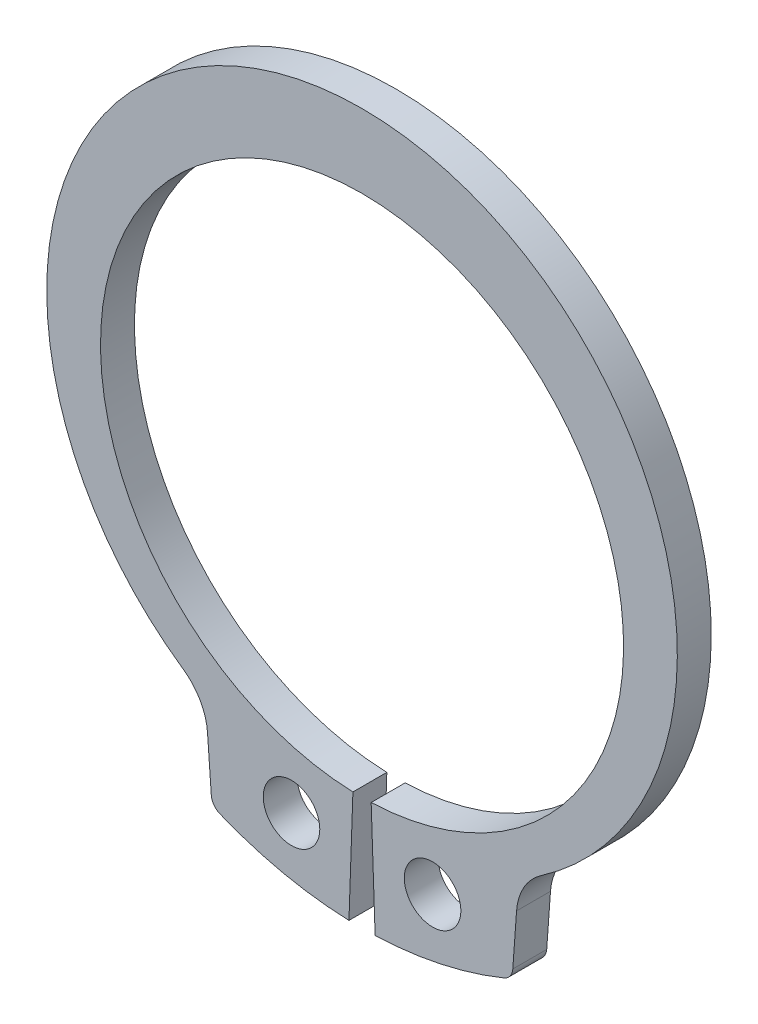
ISO-10303-21;
HEADER;
FILE_DESCRIPTION(('STEP AP214'),'2;1');
FILE_NAME('part.step','',(''),(''),'','','');
FILE_SCHEMA(('AUTOMOTIVE_DESIGN { 1 0 10303 214 1 1 1 1 }'));
ENDSEC;
DATA;
#1=APPLICATION_CONTEXT('core data for automotive mechanical design processes');
#2=APPLICATION_PROTOCOL_DEFINITION('international standard','automotive_design',2000,#1);
#3=PRODUCT_CONTEXT('',#1,'mechanical');
#4=PRODUCT('Part','Part','',(#3));
#5=PRODUCT_RELATED_PRODUCT_CATEGORY('part','',(#4));
#6=PRODUCT_DEFINITION_FORMATION('','',#4);
#7=PRODUCT_DEFINITION_CONTEXT('part definition',#1,'design');
#8=PRODUCT_DEFINITION('design','',#6,#7);
#9=PRODUCT_DEFINITION_SHAPE('','',#8);
#10=(LENGTH_UNIT() NAMED_UNIT(*) SI_UNIT(.MILLI.,.METRE.));
#11=(NAMED_UNIT(*) PLANE_ANGLE_UNIT() SI_UNIT($,.RADIAN.));
#12=(NAMED_UNIT(*) SI_UNIT($,.STERADIAN.) SOLID_ANGLE_UNIT());
#13=UNCERTAINTY_MEASURE_WITH_UNIT(LENGTH_MEASURE(1.E-05),#10,'distance_accuracy_value','');
#14=(GEOMETRIC_REPRESENTATION_CONTEXT(3) GLOBAL_UNCERTAINTY_ASSIGNED_CONTEXT((#13)) GLOBAL_UNIT_ASSIGNED_CONTEXT((#10,
#11,#12)) REPRESENTATION_CONTEXT('',''));
#15=CARTESIAN_POINT('',(0.,0.,0.));
#16=DIRECTION('',(0.,0.,1.));
#17=DIRECTION('',(1.,0.,0.));
#18=AXIS2_PLACEMENT_3D('',#15,#16,#17);
#19=CARTESIAN_POINT('',(0.,0.699014962890159,0.6));
#20=DIRECTION('',(0.,0.,1.));
#21=DIRECTION('',(1.,0.,0.));
#22=AXIS2_PLACEMENT_3D('',#19,#20,#21);
#23=PLANE('',#22);
#24=DIRECTION('',(0.0720475958887649,-0.997401195069792,0.));
#25=VECTOR('',#24,1.);
#26=CARTESIAN_POINT('',(-5.30952849671275,-12.148477213781,0.6));
#27=LINE('',#26,#25);
#28=CARTESIAN_POINT('',(-5.46518902907064,-9.99356837770187,0.6));
#29=VERTEX_POINT('',#28);
#30=CARTESIAN_POINT('',(-5.3317276412391,-11.841160182491,0.6));
#31=VERTEX_POINT('',#30);
#32=EDGE_CURVE('E218',#29,#31,#27,.T.);
#33=ORIENTED_EDGE('',*,*,#32,.T.);
#34=CARTESIAN_POINT('',(-4.82957061953166,-11.8048867086357,0.6));
#35=DIRECTION('',(0.,0.,1.));
#36=DIRECTION('',(1.,0.,0.));
#37=AXIS2_PLACEMENT_3D('',#34,#35,#36);
#38=CIRCLE('',#37,0.503465430149513);
#39=CARTESIAN_POINT('',(-5.02020927117973,-12.2708634718476,0.6));
#40=VERTEX_POINT('',#39);
#41=EDGE_CURVE('E12',#31,#40,#38,.T.);
#42=ORIENTED_EDGE('',*,*,#41,.T.);
#43=CARTESIAN_POINT('',(0.,0.,0.6));
#44=DIRECTION('',(0.,0.,1.));
#45=DIRECTION('',(1.,0.,0.));
#46=AXIS2_PLACEMENT_3D('',#43,#44,#45);
#47=CIRCLE('',#46,13.2580764619594);
#48=CARTESIAN_POINT('',(-0.462700195765678,-13.25,0.6));
#49=VERTEX_POINT('',#48);
#50=EDGE_CURVE('E222',#40,#49,#47,.T.);
#51=ORIENTED_EDGE('',*,*,#50,.T.);
#52=DIRECTION('',(0.0348994967025027,0.999390827019096,0.));
#53=VECTOR('',#52,1.);
#54=CARTESIAN_POINT('',(-0.462700195765678,-13.25,0.6));
#55=LINE('',#54,#53);
#56=CARTESIAN_POINT('',(-0.322820344498148,-9.24436514992663,0.6));
#57=VERTEX_POINT('',#56);
#58=EDGE_CURVE('E225',#49,#57,#55,.T.);
#59=ORIENTED_EDGE('',*,*,#58,.T.);
#60=CARTESIAN_POINT('',(0.,0.,0.6));
#61=DIRECTION('',(0.,0.,-1.));
#62=DIRECTION('',(1.,0.,0.));
#63=AXIS2_PLACEMENT_3D('',#60,#61,#62);
#64=CIRCLE('',#63,9.25);
#65=CARTESIAN_POINT('',(0.322820344498144,-9.24436514992663,0.6));
#66=VERTEX_POINT('',#65);
#67=EDGE_CURVE('E160',#57,#66,#64,.T.);
#68=ORIENTED_EDGE('',*,*,#67,.T.);
#69=DIRECTION('',(-0.0348994967025022,0.999390827019096,0.));
#70=VECTOR('',#69,1.);
#71=CARTESIAN_POINT('',(0.462700195765671,-13.25,0.6));
#72=LINE('',#71,#70);
#73=CARTESIAN_POINT('',(0.462700195765671,-13.25,0.6));
#74=VERTEX_POINT('',#73);
#75=EDGE_CURVE('E138',#74,#66,#72,.T.);
#76=ORIENTED_EDGE('',*,*,#75,.F.);
#77=CARTESIAN_POINT('',(0.,0.,0.6));
#78=DIRECTION('',(0.,0.,-1.));
#79=DIRECTION('',(-1.,0.,0.));
#80=AXIS2_PLACEMENT_3D('',#77,#78,#79);
#81=CIRCLE('',#80,13.2580764619594);
#82=CARTESIAN_POINT('',(5.02020927117973,-12.2708634718476,0.6));
#83=VERTEX_POINT('',#82);
#84=EDGE_CURVE('E149',#83,#74,#81,.T.);
#85=ORIENTED_EDGE('',*,*,#84,.F.);
#86=CARTESIAN_POINT('',(4.82957061953165,-11.8048867086357,0.6));
#87=DIRECTION('',(0.,0.,-1.));
#88=DIRECTION('',(-1.,0.,0.));
#89=AXIS2_PLACEMENT_3D('',#86,#87,#88);
#90=CIRCLE('',#89,0.503465430149513);
#91=CARTESIAN_POINT('',(5.3317276412391,-11.841160182491,0.6));
#92=VERTEX_POINT('',#91);
#93=EDGE_CURVE('E202',#92,#83,#90,.T.);
#94=ORIENTED_EDGE('',*,*,#93,.F.);
#95=DIRECTION('',(-0.0720475958887654,-0.997401195069792,0.));
#96=VECTOR('',#95,1.);
#97=CARTESIAN_POINT('',(5.30952849671274,-12.148477213781,0.6));
#98=LINE('',#97,#96);
#99=CARTESIAN_POINT('',(5.46518902907063,-9.99356837770188,0.6));
#100=VERTEX_POINT('',#99);
#101=EDGE_CURVE('E156',#100,#92,#98,.T.);
#102=ORIENTED_EDGE('',*,*,#101,.F.);
#103=CARTESIAN_POINT('',(7.47381711590044,-10.1386622731234,0.6));
#104=DIRECTION('',(0.,0.,-1.));
#105=DIRECTION('',(-1.,0.,0.));
#106=AXIS2_PLACEMENT_3D('',#103,#104,#105);
#107=CIRCLE('',#106,2.01386172059805);
#108=CARTESIAN_POINT('',(6.33052737820182,-8.48079388107196,0.6));
#109=VERTEX_POINT('',#108);
#110=EDGE_CURVE('E189',#109,#100,#107,.F.);
#111=ORIENTED_EDGE('',*,*,#110,.F.);
#112=CARTESIAN_POINT('',(0.,0.699014962890159,0.6));
#113=DIRECTION('',(0.,0.,1.));
#114=DIRECTION('',(1.,0.,0.));
#115=AXIS2_PLACEMENT_3D('',#112,#113,#114);
#116=CIRCLE('',#115,11.1509850371099);
#117=CARTESIAN_POINT('',(-6.33052737820182,-8.48079388107196,0.6));
#118=VERTEX_POINT('',#117);
#119=EDGE_CURVE('E214',#109,#118,#116,.T.);
#120=ORIENTED_EDGE('',*,*,#119,.T.);
#121=CARTESIAN_POINT('',(-7.47381711590044,-10.1386622731234,0.6));
#122=DIRECTION('',(0.,0.,1.));
#123=DIRECTION('',(1.,0.,0.));
#124=AXIS2_PLACEMENT_3D('',#121,#122,#123);
#125=CIRCLE('',#124,2.01386172059805);
#126=EDGE_CURVE('E262',#118,#29,#125,.F.);
#127=ORIENTED_EDGE('',*,*,#126,.T.);
#128=EDGE_LOOP('',(#33,#42,#51,#59,#68,#76,#85,#94,#102,#111,#120,#127));
#129=FACE_BOUND('',#128,.T.);
#130=CARTESIAN_POINT('',(-2.49406971966085,-10.9741966784737,0.6));
#131=DIRECTION('',(0.,0.,1.));
#132=DIRECTION('',(1.,0.,0.));
#133=AXIS2_PLACEMENT_3D('',#130,#131,#132);
#134=CIRCLE('',#133,1.);
#135=CARTESIAN_POINT('',(-1.49406971966085,-10.9741966784737,0.6));
#136=VERTEX_POINT('',#135);
#137=EDGE_CURVE('E206',#136,#136,#134,.T.);
#138=ORIENTED_EDGE('',*,*,#137,.F.);
#139=EDGE_LOOP('',(#138));
#140=FACE_BOUND('',#139,.T.);
#141=CARTESIAN_POINT('',(2.49406971966084,-10.9741966784737,0.6));
#142=DIRECTION('',(0.,0.,-1.));
#143=DIRECTION('',(-1.,0.,0.));
#144=AXIS2_PLACEMENT_3D('',#141,#142,#143);
#145=CIRCLE('',#144,1.);
#146=CARTESIAN_POINT('',(1.49406971966084,-10.9741966784737,0.6));
#147=VERTEX_POINT('',#146);
#148=EDGE_CURVE('E174',#147,#147,#145,.T.);
#149=ORIENTED_EDGE('',*,*,#148,.T.);
#150=EDGE_LOOP('',(#149));
#151=FACE_BOUND('',#150,.T.);
#152=ADVANCED_FACE('F43',(#129,#140,#151),#23,.T.);
#153=CARTESIAN_POINT('',(0.,0.699014962890159,-0.6));
#154=DIRECTION('',(0.,0.,1.));
#155=DIRECTION('',(1.,0.,0.));
#156=AXIS2_PLACEMENT_3D('',#153,#154,#155);
#157=PLANE('',#156);
#158=CARTESIAN_POINT('',(0.,0.,-0.6));
#159=DIRECTION('',(0.,0.,1.));
#160=DIRECTION('',(1.,0.,0.));
#161=AXIS2_PLACEMENT_3D('',#158,#159,#160);
#162=CIRCLE('',#161,13.2580764619594);
#163=CARTESIAN_POINT('',(-5.02020927117973,-12.2708634718476,-0.6));
#164=VERTEX_POINT('',#163);
#165=CARTESIAN_POINT('',(-0.462700195765678,-13.25,-0.6));
#166=VERTEX_POINT('',#165);
#167=EDGE_CURVE('E237',#164,#166,#162,.T.);
#168=ORIENTED_EDGE('',*,*,#167,.F.);
#169=CARTESIAN_POINT('',(-4.82957061953166,-11.8048867086357,-0.6));
#170=DIRECTION('',(0.,0.,1.));
#171=DIRECTION('',(1.,0.,0.));
#172=AXIS2_PLACEMENT_3D('',#169,#170,#171);
#173=CIRCLE('',#172,0.503465430149513);
#174=CARTESIAN_POINT('',(-5.3317276412391,-11.841160182491,-0.6));
#175=VERTEX_POINT('',#174);
#176=EDGE_CURVE('E66',#164,#175,#173,.F.);
#177=ORIENTED_EDGE('',*,*,#176,.T.);
#178=DIRECTION('',(0.0720475958887649,-0.997401195069792,0.));
#179=VECTOR('',#178,1.);
#180=CARTESIAN_POINT('',(-5.30952849671275,-12.148477213781,-0.6));
#181=LINE('',#180,#179);
#182=CARTESIAN_POINT('',(-5.46518902907064,-9.99356837770187,-0.6));
#183=VERTEX_POINT('',#182);
#184=EDGE_CURVE('E234',#183,#175,#181,.T.);
#185=ORIENTED_EDGE('',*,*,#184,.F.);
#186=CARTESIAN_POINT('',(-7.47381711590044,-10.1386622731234,-0.6));
#187=DIRECTION('',(0.,0.,1.));
#188=DIRECTION('',(1.,0.,0.));
#189=AXIS2_PLACEMENT_3D('',#186,#187,#188);
#190=CIRCLE('',#189,2.01386172059805);
#191=CARTESIAN_POINT('',(-6.33052737820182,-8.48079388107196,-0.6));
#192=VERTEX_POINT('',#191);
#193=EDGE_CURVE('E259',#183,#192,#190,.T.);
#194=ORIENTED_EDGE('',*,*,#193,.T.);
#195=CARTESIAN_POINT('',(0.,0.699014962890159,-0.6));
#196=DIRECTION('',(0.,0.,1.));
#197=DIRECTION('',(1.,0.,0.));
#198=AXIS2_PLACEMENT_3D('',#195,#196,#197);
#199=CIRCLE('',#198,11.1509850371099);
#200=CARTESIAN_POINT('',(6.33052737820182,-8.48079388107196,-0.6));
#201=VERTEX_POINT('',#200);
#202=EDGE_CURVE('E210',#201,#192,#199,.T.);
#203=ORIENTED_EDGE('',*,*,#202,.F.);
#204=CARTESIAN_POINT('',(7.47381711590044,-10.1386622731234,-0.6));
#205=DIRECTION('',(0.,0.,-1.));
#206=DIRECTION('',(-1.,0.,0.));
#207=AXIS2_PLACEMENT_3D('',#204,#205,#206);
#208=CIRCLE('',#207,2.01386172059805);
#209=CARTESIAN_POINT('',(5.46518902907063,-9.99356837770188,-0.6));
#210=VERTEX_POINT('',#209);
#211=EDGE_CURVE('E185',#210,#201,#208,.T.);
#212=ORIENTED_EDGE('',*,*,#211,.F.);
#213=DIRECTION('',(-0.0720475958887654,-0.997401195069792,0.));
#214=VECTOR('',#213,1.);
#215=CARTESIAN_POINT('',(5.30952849671274,-12.148477213781,-0.6));
#216=LINE('',#215,#214);
#217=CARTESIAN_POINT('',(5.3317276412391,-11.841160182491,-0.6));
#218=VERTEX_POINT('',#217);
#219=EDGE_CURVE('E169',#210,#218,#216,.T.);
#220=ORIENTED_EDGE('',*,*,#219,.T.);
#221=CARTESIAN_POINT('',(4.82957061953165,-11.8048867086357,-0.6));
#222=DIRECTION('',(0.,0.,-1.));
#223=DIRECTION('',(-1.,0.,0.));
#224=AXIS2_PLACEMENT_3D('',#221,#222,#223);
#225=CIRCLE('',#224,0.503465430149513);
#226=CARTESIAN_POINT('',(5.02020927117973,-12.2708634718476,-0.6));
#227=VERTEX_POINT('',#226);
#228=EDGE_CURVE('E195',#227,#218,#225,.F.);
#229=ORIENTED_EDGE('',*,*,#228,.F.);
#230=CARTESIAN_POINT('',(0.,0.,-0.6));
#231=DIRECTION('',(0.,0.,-1.));
#232=DIRECTION('',(-1.,0.,0.));
#233=AXIS2_PLACEMENT_3D('',#230,#231,#232);
#234=CIRCLE('',#233,13.2580764619594);
#235=CARTESIAN_POINT('',(0.462700195765671,-13.25,-0.6));
#236=VERTEX_POINT('',#235);
#237=EDGE_CURVE('E173',#227,#236,#234,.T.);
#238=ORIENTED_EDGE('',*,*,#237,.T.);
#239=DIRECTION('',(-0.0348994967025022,0.999390827019096,0.));
#240=VECTOR('',#239,1.);
#241=CARTESIAN_POINT('',(0.462700195765671,-13.25,-0.6));
#242=LINE('',#241,#240);
#243=CARTESIAN_POINT('',(0.322820344498144,-9.24436514992663,-0.6));
#244=VERTEX_POINT('',#243);
#245=EDGE_CURVE('E140',#236,#244,#242,.T.);
#246=ORIENTED_EDGE('',*,*,#245,.T.);
#247=CARTESIAN_POINT('',(0.,0.,-0.6));
#248=DIRECTION('',(0.,0.,-1.));
#249=DIRECTION('',(1.,0.,0.));
#250=AXIS2_PLACEMENT_3D('',#247,#248,#249);
#251=CIRCLE('',#250,9.25);
#252=CARTESIAN_POINT('',(-0.322820344498148,-9.24436514992663,-0.6));
#253=VERTEX_POINT('',#252);
#254=EDGE_CURVE('E219',#253,#244,#251,.T.);
#255=ORIENTED_EDGE('',*,*,#254,.F.);
#256=DIRECTION('',(0.0348994967025027,0.999390827019096,0.));
#257=VECTOR('',#256,1.);
#258=CARTESIAN_POINT('',(-0.462700195765678,-13.25,-0.6));
#259=LINE('',#258,#257);
#260=EDGE_CURVE('E240',#166,#253,#259,.T.);
#261=ORIENTED_EDGE('',*,*,#260,.F.);
#262=EDGE_LOOP('',(#168,#177,#185,#194,#203,#212,#220,#229,#238,#246,#255,#261));
#263=FACE_BOUND('',#262,.T.);
#264=CARTESIAN_POINT('',(-2.49406971966085,-10.9741966784737,-0.6));
#265=DIRECTION('',(0.,0.,1.));
#266=DIRECTION('',(1.,0.,0.));
#267=AXIS2_PLACEMENT_3D('',#264,#265,#266);
#268=CIRCLE('',#267,1.);
#269=CARTESIAN_POINT('',(-1.49406971966085,-10.9741966784737,-0.6));
#270=VERTEX_POINT('',#269);
#271=EDGE_CURVE('E205',#270,#270,#268,.T.);
#272=ORIENTED_EDGE('',*,*,#271,.T.);
#273=EDGE_LOOP('',(#272));
#274=FACE_BOUND('',#273,.T.);
#275=CARTESIAN_POINT('',(2.49406971966084,-10.9741966784737,-0.6));
#276=DIRECTION('',(0.,0.,-1.));
#277=DIRECTION('',(-1.,0.,0.));
#278=AXIS2_PLACEMENT_3D('',#275,#276,#277);
#279=CIRCLE('',#278,1.);
#280=CARTESIAN_POINT('',(1.49406971966084,-10.9741966784737,-0.6));
#281=VERTEX_POINT('',#280);
#282=EDGE_CURVE('E333',#281,#281,#279,.T.);
#283=ORIENTED_EDGE('',*,*,#282,.F.);
#284=EDGE_LOOP('',(#283));
#285=FACE_BOUND('',#284,.T.);
#286=ADVANCED_FACE('F311',(#263,#274,#285),#157,.F.);
#287=CARTESIAN_POINT('',(0.,0.699014962890159,0.6));
#288=DIRECTION('',(0.,0.,-1.));
#289=DIRECTION('',(-1.,0.,0.));
#290=AXIS2_PLACEMENT_3D('',#287,#288,#289);
#291=CYLINDRICAL_SURFACE('',#290,11.1509850371099);
#292=ORIENTED_EDGE('',*,*,#202,.T.);
#293=DIRECTION('',(0.,0.,-1.));
#294=VECTOR('',#293,1.);
#295=CARTESIAN_POINT('',(-6.33052737820182,-8.48079388107196,0.6));
#296=LINE('',#295,#294);
#297=EDGE_CURVE('E256',#192,#118,#296,.F.);
#298=ORIENTED_EDGE('',*,*,#297,.T.);
#299=ORIENTED_EDGE('',*,*,#119,.F.);
#300=DIRECTION('',(0.,0.,-1.));
#301=VECTOR('',#300,1.);
#302=CARTESIAN_POINT('',(6.33052737820182,-8.48079388107196,0.6));
#303=LINE('',#302,#301);
#304=EDGE_CURVE('E181',#201,#109,#303,.F.);
#305=ORIENTED_EDGE('',*,*,#304,.F.);
#306=EDGE_LOOP('',(#292,#298,#299,#305));
#307=FACE_BOUND('',#306,.T.);
#308=ADVANCED_FACE('F351',(#307),#291,.T.);
#309=CARTESIAN_POINT('',(-5.30952849671275,-12.148477213781,0.6));
#310=DIRECTION('',(0.997401195069792,0.0720475958887649,0.));
#311=DIRECTION('',(-0.0720475958887649,0.997401195069792,0.));
#312=AXIS2_PLACEMENT_3D('',#309,#310,#311);
#313=PLANE('',#312);
#314=ORIENTED_EDGE('',*,*,#184,.T.);
#315=DIRECTION('',(0.,0.,-1.));
#316=VECTOR('',#315,1.);
#317=CARTESIAN_POINT('',(-5.3317276412391,-11.841160182491,0.6));
#318=LINE('',#317,#316);
#319=EDGE_CURVE('E52',#175,#31,#318,.F.);
#320=ORIENTED_EDGE('',*,*,#319,.T.);
#321=ORIENTED_EDGE('',*,*,#32,.F.);
#322=DIRECTION('',(0.,0.,1.));
#323=VECTOR('',#322,1.);
#324=CARTESIAN_POINT('',(-5.46518902907064,-9.99356837770187,-0.6));
#325=LINE('',#324,#323);
#326=EDGE_CURVE('E252',#29,#183,#325,.F.);
#327=ORIENTED_EDGE('',*,*,#326,.T.);
#328=EDGE_LOOP('',(#314,#320,#321,#327));
#329=FACE_BOUND('',#328,.T.);
#330=ADVANCED_FACE('F357',(#329),#313,.F.);
#331=CARTESIAN_POINT('',(0.,0.,0.6));
#332=DIRECTION('',(0.,0.,-1.));
#333=DIRECTION('',(-1.,0.,0.));
#334=AXIS2_PLACEMENT_3D('',#331,#332,#333);
#335=CYLINDRICAL_SURFACE('',#334,13.2580764619594);
#336=ORIENTED_EDGE('',*,*,#50,.F.);
#337=DIRECTION('',(0.,0.,-1.));
#338=VECTOR('',#337,1.);
#339=CARTESIAN_POINT('',(-5.02020927117973,-12.2708634718476,0.6));
#340=LINE('',#339,#338);
#341=EDGE_CURVE('E265',#40,#164,#340,.T.);
#342=ORIENTED_EDGE('',*,*,#341,.T.);
#343=ORIENTED_EDGE('',*,*,#167,.T.);
#344=DIRECTION('',(0.,0.,-1.));
#345=VECTOR('',#344,1.);
#346=CARTESIAN_POINT('',(-0.462700195765678,-13.25,0.6));
#347=LINE('',#346,#345);
#348=EDGE_CURVE('E248',#49,#166,#347,.T.);
#349=ORIENTED_EDGE('',*,*,#348,.F.);
#350=EDGE_LOOP('',(#336,#342,#343,#349));
#351=FACE_BOUND('',#350,.T.);
#352=ADVANCED_FACE('F306',(#351),#335,.T.);
#353=CARTESIAN_POINT('',(-0.462700195765678,-13.25,0.6));
#354=DIRECTION('',(-0.999390827019096,0.0348994967025027,0.));
#355=DIRECTION('',(-0.0348994967025027,-0.999390827019096,0.));
#356=AXIS2_PLACEMENT_3D('',#353,#354,#355);
#357=PLANE('',#356);
#358=ORIENTED_EDGE('',*,*,#260,.T.);
#359=DIRECTION('',(0.,0.,-1.));
#360=VECTOR('',#359,1.);
#361=CARTESIAN_POINT('',(-0.322820344498148,-9.24436514992663,0.6));
#362=LINE('',#361,#360);
#363=EDGE_CURVE('E230',#57,#253,#362,.T.);
#364=ORIENTED_EDGE('',*,*,#363,.F.);
#365=ORIENTED_EDGE('',*,*,#58,.F.);
#366=ORIENTED_EDGE('',*,*,#348,.T.);
#367=EDGE_LOOP('',(#358,#364,#365,#366));
#368=FACE_BOUND('',#367,.T.);
#369=ADVANCED_FACE('F316',(#368),#357,.F.);
#370=CARTESIAN_POINT('',(0.,0.,0.6));
#371=DIRECTION('',(0.,0.,-1.));
#372=DIRECTION('',(-1.,0.,0.));
#373=AXIS2_PLACEMENT_3D('',#370,#371,#372);
#374=CYLINDRICAL_SURFACE('',#373,9.25);
#375=ORIENTED_EDGE('',*,*,#254,.T.);
#376=DIRECTION('',(0.,0.,-1.));
#377=VECTOR('',#376,1.);
#378=CARTESIAN_POINT('',(0.322820344498144,-9.24436514992663,0.6));
#379=LINE('',#378,#377);
#380=EDGE_CURVE('E146',#66,#244,#379,.T.);
#381=ORIENTED_EDGE('',*,*,#380,.F.);
#382=ORIENTED_EDGE('',*,*,#67,.F.);
#383=ORIENTED_EDGE('',*,*,#363,.T.);
#384=EDGE_LOOP('',(#375,#381,#382,#383));
#385=FACE_BOUND('',#384,.T.);
#386=ADVANCED_FACE('F319',(#385),#374,.F.);
#387=CARTESIAN_POINT('',(-2.49406971966085,-10.9741966784737,0.6));
#388=DIRECTION('',(0.,0.,-1.));
#389=DIRECTION('',(-1.,0.,0.));
#390=AXIS2_PLACEMENT_3D('',#387,#388,#389);
#391=CYLINDRICAL_SURFACE('',#390,1.);
#392=ORIENTED_EDGE('',*,*,#137,.T.);
#393=EDGE_LOOP('',(#392));
#394=FACE_BOUND('',#393,.T.);
#395=ORIENTED_EDGE('',*,*,#271,.F.);
#396=EDGE_LOOP('',(#395));
#397=FACE_BOUND('',#396,.T.);
#398=ADVANCED_FACE('F365',(#394,#397),#391,.F.);
#399=CARTESIAN_POINT('',(-7.47381711590044,-10.1386622731234,0.6));
#400=DIRECTION('',(0.,0.,-1.));
#401=DIRECTION('',(-1.,0.,0.));
#402=AXIS2_PLACEMENT_3D('',#399,#400,#401);
#403=CYLINDRICAL_SURFACE('',#402,2.01386172059805);
#404=ORIENTED_EDGE('',*,*,#126,.F.);
#405=ORIENTED_EDGE('',*,*,#297,.F.);
#406=ORIENTED_EDGE('',*,*,#193,.F.);
#407=ORIENTED_EDGE('',*,*,#326,.F.);
#408=EDGE_LOOP('',(#404,#405,#406,#407));
#409=FACE_BOUND('',#408,.T.);
#410=ADVANCED_FACE('F371',(#409),#403,.F.);
#411=CARTESIAN_POINT('',(-4.82957061953166,-11.8048867086357,0.6));
#412=DIRECTION('',(0.,0.,-1.));
#413=DIRECTION('',(-1.,0.,0.));
#414=AXIS2_PLACEMENT_3D('',#411,#412,#413);
#415=CYLINDRICAL_SURFACE('',#414,0.503465430149513);
#416=ORIENTED_EDGE('',*,*,#41,.F.);
#417=ORIENTED_EDGE('',*,*,#319,.F.);
#418=ORIENTED_EDGE('',*,*,#176,.F.);
#419=ORIENTED_EDGE('',*,*,#341,.F.);
#420=EDGE_LOOP('',(#416,#417,#418,#419));
#421=FACE_BOUND('',#420,.T.);
#422=ADVANCED_FACE('F45',(#421),#415,.T.);
#423=CARTESIAN_POINT('',(5.30952849671274,-12.148477213781,0.6));
#424=DIRECTION('',(-0.997401195069792,0.0720475958887654,0.));
#425=DIRECTION('',(0.0720475958887654,0.997401195069792,0.));
#426=AXIS2_PLACEMENT_3D('',#423,#424,#425);
#427=PLANE('',#426);
#428=ORIENTED_EDGE('',*,*,#219,.F.);
#429=DIRECTION('',(0.,0.,1.));
#430=VECTOR('',#429,1.);
#431=CARTESIAN_POINT('',(5.46518902907063,-9.99356837770188,-0.6));
#432=LINE('',#431,#430);
#433=EDGE_CURVE('E145',#100,#210,#432,.F.);
#434=ORIENTED_EDGE('',*,*,#433,.F.);
#435=ORIENTED_EDGE('',*,*,#101,.T.);
#436=DIRECTION('',(0.,0.,-1.));
#437=VECTOR('',#436,1.);
#438=CARTESIAN_POINT('',(5.3317276412391,-11.841160182491,0.6));
#439=LINE('',#438,#437);
#440=EDGE_CURVE('E199',#218,#92,#439,.F.);
#441=ORIENTED_EDGE('',*,*,#440,.F.);
#442=EDGE_LOOP('',(#428,#434,#435,#441));
#443=FACE_BOUND('',#442,.T.);
#444=ADVANCED_FACE('F329',(#443),#427,.F.);
#445=CARTESIAN_POINT('',(0.,0.,0.6));
#446=DIRECTION('',(0.,0.,-1.));
#447=DIRECTION('',(1.,0.,0.));
#448=AXIS2_PLACEMENT_3D('',#445,#446,#447);
#449=CYLINDRICAL_SURFACE('',#448,13.2580764619594);
#450=ORIENTED_EDGE('',*,*,#84,.T.);
#451=DIRECTION('',(0.,0.,-1.));
#452=VECTOR('',#451,1.);
#453=CARTESIAN_POINT('',(0.462700195765671,-13.25,0.6));
#454=LINE('',#453,#452);
#455=EDGE_CURVE('E133',#74,#236,#454,.T.);
#456=ORIENTED_EDGE('',*,*,#455,.T.);
#457=ORIENTED_EDGE('',*,*,#237,.F.);
#458=DIRECTION('',(0.,0.,-1.));
#459=VECTOR('',#458,1.);
#460=CARTESIAN_POINT('',(5.02020927117973,-12.2708634718476,0.6));
#461=LINE('',#460,#459);
#462=EDGE_CURVE('E151',#83,#227,#461,.T.);
#463=ORIENTED_EDGE('',*,*,#462,.F.);
#464=EDGE_LOOP('',(#450,#456,#457,#463));
#465=FACE_BOUND('',#464,.T.);
#466=ADVANCED_FACE('F150',(#465),#449,.T.);
#467=CARTESIAN_POINT('',(0.462700195765671,-13.25,0.6));
#468=DIRECTION('',(0.999390827019096,0.0348994967025022,0.));
#469=DIRECTION('',(0.0348994967025022,-0.999390827019096,0.));
#470=AXIS2_PLACEMENT_3D('',#467,#468,#469);
#471=PLANE('',#470);
#472=ORIENTED_EDGE('',*,*,#245,.F.);
#473=ORIENTED_EDGE('',*,*,#455,.F.);
#474=ORIENTED_EDGE('',*,*,#75,.T.);
#475=ORIENTED_EDGE('',*,*,#380,.T.);
#476=EDGE_LOOP('',(#472,#473,#474,#475));
#477=FACE_BOUND('',#476,.T.);
#478=ADVANCED_FACE('F135',(#477),#471,.F.);
#479=CARTESIAN_POINT('',(2.49406971966084,-10.9741966784737,0.6));
#480=DIRECTION('',(0.,0.,-1.));
#481=DIRECTION('',(1.,0.,0.));
#482=AXIS2_PLACEMENT_3D('',#479,#480,#481);
#483=CYLINDRICAL_SURFACE('',#482,1.);
#484=ORIENTED_EDGE('',*,*,#148,.F.);
#485=EDGE_LOOP('',(#484));
#486=FACE_BOUND('',#485,.T.);
#487=ORIENTED_EDGE('',*,*,#282,.T.);
#488=EDGE_LOOP('',(#487));
#489=FACE_BOUND('',#488,.T.);
#490=ADVANCED_FACE('F343',(#486,#489),#483,.F.);
#491=CARTESIAN_POINT('',(7.47381711590044,-10.1386622731234,0.6));
#492=DIRECTION('',(0.,0.,-1.));
#493=DIRECTION('',(1.,0.,0.));
#494=AXIS2_PLACEMENT_3D('',#491,#492,#493);
#495=CYLINDRICAL_SURFACE('',#494,2.01386172059805);
#496=ORIENTED_EDGE('',*,*,#110,.T.);
#497=ORIENTED_EDGE('',*,*,#433,.T.);
#498=ORIENTED_EDGE('',*,*,#211,.T.);
#499=ORIENTED_EDGE('',*,*,#304,.T.);
#500=EDGE_LOOP('',(#496,#497,#498,#499));
#501=FACE_BOUND('',#500,.T.);
#502=ADVANCED_FACE('F346',(#501),#495,.F.);
#503=CARTESIAN_POINT('',(4.82957061953165,-11.8048867086357,0.6));
#504=DIRECTION('',(0.,0.,-1.));
#505=DIRECTION('',(1.,0.,0.));
#506=AXIS2_PLACEMENT_3D('',#503,#504,#505);
#507=CYLINDRICAL_SURFACE('',#506,0.503465430149513);
#508=ORIENTED_EDGE('',*,*,#93,.T.);
#509=ORIENTED_EDGE('',*,*,#462,.T.);
#510=ORIENTED_EDGE('',*,*,#228,.T.);
#511=ORIENTED_EDGE('',*,*,#440,.T.);
#512=EDGE_LOOP('',(#508,#509,#510,#511));
#513=FACE_BOUND('',#512,.T.);
#514=ADVANCED_FACE('F324',(#513),#507,.T.);
#515=CLOSED_SHELL('',(#152,#286,#308,#330,#352,#369,#386,#398,#410,#422,#444,#466,#478,#490,
#502,#514));
#516=MANIFOLD_SOLID_BREP('B2',#515);
#517=ADVANCED_BREP_SHAPE_REPRESENTATION('',(#18,#516),#14);
#518=SHAPE_DEFINITION_REPRESENTATION(#9,#517);
ENDSEC;
END-ISO-10303-21;
